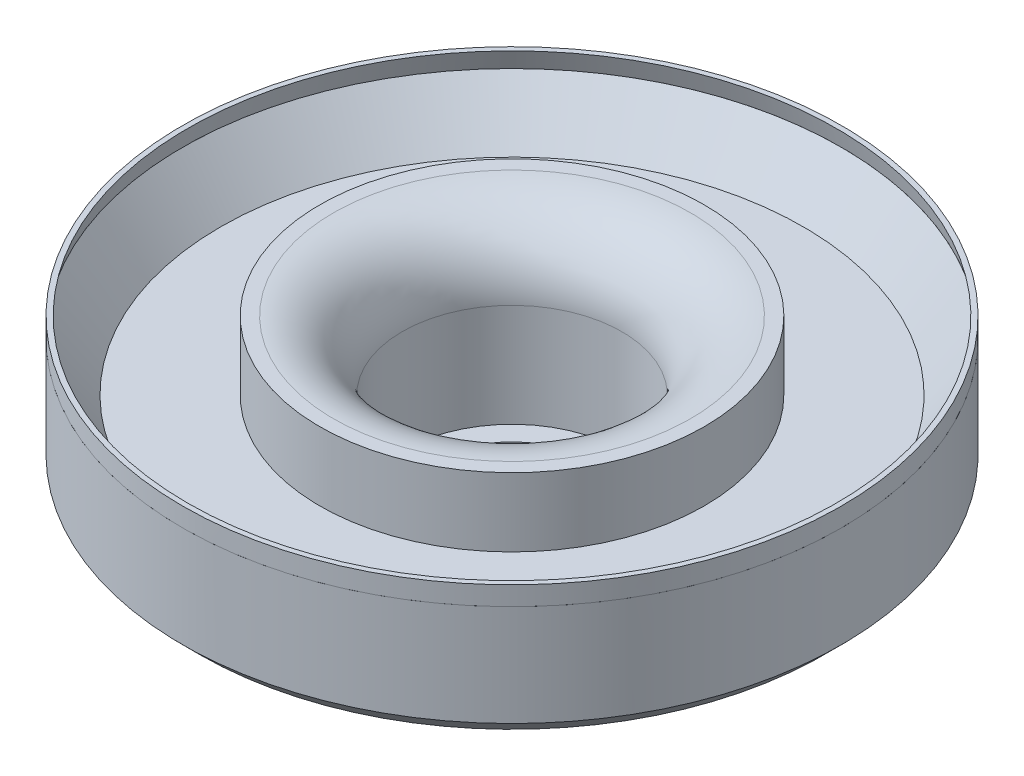
ISO-10303-21;
HEADER;
FILE_DESCRIPTION(('STEP AP214'),'2;1');
FILE_NAME('part.step','',(''),(''),'','','');
FILE_SCHEMA(('AUTOMOTIVE_DESIGN { 1 0 10303 214 1 1 1 1 }'));
ENDSEC;
DATA;
#1=APPLICATION_CONTEXT('core data for automotive mechanical design processes');
#2=APPLICATION_PROTOCOL_DEFINITION('international standard','automotive_design',2000,#1);
#3=PRODUCT_CONTEXT('',#1,'mechanical');
#4=PRODUCT('Part','Part','',(#3));
#5=PRODUCT_RELATED_PRODUCT_CATEGORY('part','',(#4));
#6=PRODUCT_DEFINITION_FORMATION('','',#4);
#7=PRODUCT_DEFINITION_CONTEXT('part definition',#1,'design');
#8=PRODUCT_DEFINITION('design','',#6,#7);
#9=PRODUCT_DEFINITION_SHAPE('','',#8);
#10=(LENGTH_UNIT() NAMED_UNIT(*) SI_UNIT(.MILLI.,.METRE.));
#11=(NAMED_UNIT(*) PLANE_ANGLE_UNIT() SI_UNIT($,.RADIAN.));
#12=(NAMED_UNIT(*) SI_UNIT($,.STERADIAN.) SOLID_ANGLE_UNIT());
#13=UNCERTAINTY_MEASURE_WITH_UNIT(LENGTH_MEASURE(1.E-05),#10,'distance_accuracy_value','');
#14=(GEOMETRIC_REPRESENTATION_CONTEXT(3) GLOBAL_UNCERTAINTY_ASSIGNED_CONTEXT((#13)) GLOBAL_UNIT_ASSIGNED_CONTEXT((#10,
#11,#12)) REPRESENTATION_CONTEXT('',''));
#15=CARTESIAN_POINT('',(0.,0.,0.));
#16=DIRECTION('',(0.,0.,1.));
#17=DIRECTION('',(1.,0.,0.));
#18=AXIS2_PLACEMENT_3D('',#15,#16,#17);
#19=CARTESIAN_POINT('',(0.,13.,0.));
#20=DIRECTION('',(0.,-1.,0.));
#21=DIRECTION('',(0.,0.,-1.));
#22=AXIS2_PLACEMENT_3D('',#19,#20,#21);
#23=CYLINDRICAL_SURFACE('',#22,4.8);
#24=CARTESIAN_POINT('',(0.,11.25,0.));
#25=DIRECTION('',(0.,-1.,0.));
#26=DIRECTION('',(0.,0.,-1.));
#27=AXIS2_PLACEMENT_3D('',#24,#25,#26);
#28=CIRCLE('',#27,4.8);
#29=CARTESIAN_POINT('',(0.,11.25,-4.8));
#30=VERTEX_POINT('',#29);
#31=EDGE_CURVE('E11',#30,#30,#28,.F.);
#32=ORIENTED_EDGE('',*,*,#31,.T.);
#33=EDGE_LOOP('',(#32));
#34=FACE_BOUND('',#33,.T.);
#35=CARTESIAN_POINT('',(0.,12.7244443697168,0.));
#36=DIRECTION('',(0.,-1.,0.));
#37=DIRECTION('',(-0.837169104331222,0.,-0.546944138603989));
#38=AXIS2_PLACEMENT_3D('',#35,#36,#37);
#39=CIRCLE('',#38,4.8);
#40=CARTESIAN_POINT('',(-4.01841170078987,12.7244443697168,-2.62533186529915));
#41=VERTEX_POINT('',#40);
#42=EDGE_CURVE('E78',#41,#41,#39,.T.);
#43=ORIENTED_EDGE('',*,*,#42,.T.);
#44=EDGE_LOOP('',(#43));
#45=FACE_BOUND('',#44,.T.);
#46=ADVANCED_FACE('F57',(#34,#45),#23,.T.);
#47=CARTESIAN_POINT('',(0.,12.7244443697168,0.));
#48=DIRECTION('',(0.,1.,0.));
#49=DIRECTION('',(0.837169104331222,0.,0.546944138603989));
#50=AXIS2_PLACEMENT_3D('',#47,#48,#49);
#51=CONICAL_SURFACE('',#50,4.8,0.654498469497876);
#52=CARTESIAN_POINT('',(0.,12.,0.));
#53=DIRECTION('',(0.,-1.,0.));
#54=DIRECTION('',(-0.837169104331222,0.,-0.546944138603989));
#55=AXIS2_PLACEMENT_3D('',#52,#53,#54);
#56=CIRCLE('',#55,4.24411428382689);
#57=CARTESIAN_POINT('',(-3.5530413536707,12.,-2.32129343110458));
#58=VERTEX_POINT('',#57);
#59=EDGE_CURVE('E87',#58,#58,#56,.T.);
#60=ORIENTED_EDGE('',*,*,#59,.T.);
#61=EDGE_LOOP('',(#60));
#62=FACE_BOUND('',#61,.T.);
#63=ORIENTED_EDGE('',*,*,#42,.F.);
#64=EDGE_LOOP('',(#63));
#65=FACE_BOUND('',#64,.T.);
#66=ADVANCED_FACE('F135',(#62,#65),#51,.F.);
#67=CARTESIAN_POINT('',(2.34407349212742,12.,1.53144358809117));
#68=DIRECTION('',(0.,1.,0.));
#69=DIRECTION('',(0.837169104331222,0.,0.546944138603989));
#70=AXIS2_PLACEMENT_3D('',#67,#68,#69);
#71=PLANE('',#70);
#72=CARTESIAN_POINT('',(0.,12.,0.));
#73=DIRECTION('',(0.,-1.,0.));
#74=DIRECTION('',(-0.837169104331222,0.,-0.546944138603989));
#75=AXIS2_PLACEMENT_3D('',#72,#73,#74);
#76=CIRCLE('',#75,2.8);
#77=CARTESIAN_POINT('',(-2.34407349212742,12.,-1.53144358809117));
#78=VERTEX_POINT('',#77);
#79=EDGE_CURVE('E90',#78,#78,#76,.T.);
#80=ORIENTED_EDGE('',*,*,#79,.T.);
#81=EDGE_LOOP('',(#80));
#82=FACE_BOUND('',#81,.T.);
#83=ORIENTED_EDGE('',*,*,#59,.F.);
#84=EDGE_LOOP('',(#83));
#85=FACE_BOUND('',#84,.T.);
#86=ADVANCED_FACE('F140',(#82,#85),#71,.T.);
#87=CARTESIAN_POINT('',(0.,7.7014445131331,0.));
#88=DIRECTION('',(0.,-1.,0.));
#89=DIRECTION('',(-0.837169104331222,0.,-0.546944138603989));
#90=AXIS2_PLACEMENT_3D('',#87,#88,#89);
#91=CYLINDRICAL_SURFACE('',#90,2.8);
#92=CARTESIAN_POINT('',(0.,13.,0.));
#93=DIRECTION('',(0.,-1.,0.));
#94=DIRECTION('',(-0.837169104331222,0.,-0.546944138603989));
#95=AXIS2_PLACEMENT_3D('',#92,#93,#94);
#96=CIRCLE('',#95,2.8);
#97=CARTESIAN_POINT('',(-2.34407349212742,13.,-1.53144358809117));
#98=VERTEX_POINT('',#97);
#99=EDGE_CURVE('E93',#98,#98,#96,.T.);
#100=ORIENTED_EDGE('',*,*,#99,.T.);
#101=EDGE_LOOP('',(#100));
#102=FACE_BOUND('',#101,.T.);
#103=ORIENTED_EDGE('',*,*,#79,.F.);
#104=EDGE_LOOP('',(#103));
#105=FACE_BOUND('',#104,.T.);
#106=ADVANCED_FACE('F182',(#102,#105),#91,.T.);
#107=CARTESIAN_POINT('',(0.,13.,0.));
#108=DIRECTION('',(0.,1.,0.));
#109=DIRECTION('',(0.,0.,1.));
#110=AXIS2_PLACEMENT_3D('',#107,#108,#109);
#111=PLANE('',#110);
#112=CARTESIAN_POINT('',(0.,13.,0.));
#113=DIRECTION('',(0.,1.,0.));
#114=DIRECTION('',(0.837169104331222,0.,0.546944138603989));
#115=AXIS2_PLACEMENT_3D('',#112,#113,#114);
#116=CIRCLE('',#115,2.6);
#117=CARTESIAN_POINT('',(2.17663967126118,13.,1.42205476037037));
#118=VERTEX_POINT('',#117);
#119=EDGE_CURVE('E79',#118,#118,#116,.T.);
#120=ORIENTED_EDGE('',*,*,#119,.F.);
#121=EDGE_LOOP('',(#120));
#122=FACE_BOUND('',#121,.T.);
#123=ORIENTED_EDGE('',*,*,#99,.F.);
#124=EDGE_LOOP('',(#123));
#125=FACE_BOUND('',#124,.T.);
#126=ADVANCED_FACE('F174',(#122,#125),#111,.T.);
#127=CARTESIAN_POINT('',(0.,7.7014445131331,0.));
#128=DIRECTION('',(0.,-1.,0.));
#129=DIRECTION('',(-0.837169104331222,0.,-0.546944138603989));
#130=AXIS2_PLACEMENT_3D('',#127,#128,#129);
#131=CYLINDRICAL_SURFACE('',#130,1.6);
#132=CARTESIAN_POINT('',(0.,12.,0.));
#133=DIRECTION('',(0.,1.,0.));
#134=DIRECTION('',(0.837169104331222,0.,0.546944138603989));
#135=AXIS2_PLACEMENT_3D('',#132,#133,#134);
#136=CIRCLE('',#135,1.6);
#137=CARTESIAN_POINT('',(1.33947056692996,12.,0.875110621766382));
#138=VERTEX_POINT('',#137);
#139=EDGE_CURVE('E83',#138,#138,#136,.F.);
#140=ORIENTED_EDGE('',*,*,#139,.F.);
#141=EDGE_LOOP('',(#140));
#142=FACE_BOUND('',#141,.T.);
#143=CARTESIAN_POINT('',(0.,10.5,0.));
#144=DIRECTION('',(0.,-1.,0.));
#145=DIRECTION('',(-0.837169104331222,0.,-0.546944138603989));
#146=AXIS2_PLACEMENT_3D('',#143,#144,#145);
#147=CIRCLE('',#146,1.6);
#148=CARTESIAN_POINT('',(-1.33947056692996,10.5,-0.875110621766382));
#149=VERTEX_POINT('',#148);
#150=EDGE_CURVE('E82',#149,#149,#147,.T.);
#151=ORIENTED_EDGE('',*,*,#150,.T.);
#152=EDGE_LOOP('',(#151));
#153=FACE_BOUND('',#152,.T.);
#154=ADVANCED_FACE('F172',(#142,#153),#131,.F.);
#155=CARTESIAN_POINT('',(0.,12.,0.));
#156=DIRECTION('',(0.,1.,0.));
#157=DIRECTION('',(0.837169104331222,0.,0.546944138603989));
#158=AXIS2_PLACEMENT_3D('',#155,#156,#157);
#159=TOROIDAL_SURFACE('',#158,2.6,1.);
#160=ORIENTED_EDGE('',*,*,#119,.T.);
#161=EDGE_LOOP('',(#160));
#162=FACE_BOUND('',#161,.T.);
#163=ORIENTED_EDGE('',*,*,#139,.T.);
#164=EDGE_LOOP('',(#163));
#165=FACE_BOUND('',#164,.T.);
#166=ADVANCED_FACE('F168',(#162,#165),#159,.T.);
#167=CARTESIAN_POINT('',(1.33947056692996,10.5,0.875110621766382));
#168=DIRECTION('',(0.,1.,0.));
#169=DIRECTION('',(0.837169104331222,0.,0.546944138603989));
#170=AXIS2_PLACEMENT_3D('',#167,#168,#169);
#171=PLANE('',#170);
#172=CARTESIAN_POINT('',(0.,10.5,0.));
#173=DIRECTION('',(0.,-1.,0.));
#174=DIRECTION('',(0.546944138603989,0.,-0.837169104331222));
#175=AXIS2_PLACEMENT_3D('',#172,#173,#174);
#176=CIRCLE('',#175,1.275);
#177=CARTESIAN_POINT('',(0.697353776720086,10.5,-1.06739060802231));
#178=VERTEX_POINT('',#177);
#179=EDGE_CURVE('E86',#178,#178,#176,.T.);
#180=ORIENTED_EDGE('',*,*,#179,.T.);
#181=EDGE_LOOP('',(#180));
#182=FACE_BOUND('',#181,.T.);
#183=ORIENTED_EDGE('',*,*,#150,.F.);
#184=EDGE_LOOP('',(#183));
#185=FACE_BOUND('',#184,.T.);
#186=ADVANCED_FACE('F162',(#182,#185),#171,.T.);
#187=CARTESIAN_POINT('',(0.,10.5,0.));
#188=DIRECTION('',(0.,-1.,0.));
#189=DIRECTION('',(0.546944138603989,0.,-0.837169104331222));
#190=AXIS2_PLACEMENT_3D('',#187,#188,#189);
#191=CONICAL_SURFACE('',#190,1.275,0.785398163397479);
#192=CARTESIAN_POINT('',(0.,10.525,0.));
#193=DIRECTION('',(0.,-1.,0.));
#194=DIRECTION('',(0.,0.,-1.));
#195=AXIS2_PLACEMENT_3D('',#192,#193,#194);
#196=CIRCLE('',#195,1.25);
#197=CARTESIAN_POINT('',(0.,10.525,-1.25));
#198=VERTEX_POINT('',#197);
#199=EDGE_CURVE('E105',#198,#198,#196,.F.);
#200=ORIENTED_EDGE('',*,*,#199,.F.);
#201=EDGE_LOOP('',(#200));
#202=FACE_BOUND('',#201,.T.);
#203=ORIENTED_EDGE('',*,*,#179,.F.);
#204=EDGE_LOOP('',(#203));
#205=FACE_BOUND('',#204,.T.);
#206=ADVANCED_FACE('F131',(#202,#205),#191,.T.);
#207=CARTESIAN_POINT('',(0.,11.,0.));
#208=DIRECTION('',(0.,-1.,0.));
#209=DIRECTION('',(0.,0.,-1.));
#210=AXIS2_PLACEMENT_3D('',#207,#208,#209);
#211=PLANE('',#210);
#212=CARTESIAN_POINT('',(0.,11.,0.));
#213=DIRECTION('',(0.,-1.,0.));
#214=DIRECTION('',(0.,0.,-1.));
#215=AXIS2_PLACEMENT_3D('',#212,#213,#214);
#216=CIRCLE('',#215,4.55);
#217=CARTESIAN_POINT('',(0.,11.,-4.55));
#218=VERTEX_POINT('',#217);
#219=EDGE_CURVE('E65',#218,#218,#216,.T.);
#220=ORIENTED_EDGE('',*,*,#219,.T.);
#221=EDGE_LOOP('',(#220));
#222=FACE_BOUND('',#221,.T.);
#223=CARTESIAN_POINT('',(0.,11.,0.));
#224=DIRECTION('',(0.,-1.,0.));
#225=DIRECTION('',(0.,0.,-1.));
#226=AXIS2_PLACEMENT_3D('',#223,#224,#225);
#227=CIRCLE('',#226,3.25);
#228=CARTESIAN_POINT('',(0.,11.,-3.25));
#229=VERTEX_POINT('',#228);
#230=EDGE_CURVE('E69',#229,#229,#227,.F.);
#231=ORIENTED_EDGE('',*,*,#230,.T.);
#232=EDGE_LOOP('',(#231));
#233=FACE_BOUND('',#232,.T.);
#234=ADVANCED_FACE('F123',(#222,#233),#211,.T.);
#235=CARTESIAN_POINT('',(0.,11.,0.));
#236=DIRECTION('',(0.,-1.,0.));
#237=DIRECTION('',(0.,0.,-1.));
#238=AXIS2_PLACEMENT_3D('',#235,#236,#237);
#239=CYLINDRICAL_SURFACE('',#238,3.);
#240=CARTESIAN_POINT('',(0.,10.75,0.));
#241=DIRECTION('',(0.,-1.,0.));
#242=DIRECTION('',(0.,0.,-1.));
#243=AXIS2_PLACEMENT_3D('',#240,#241,#242);
#244=CIRCLE('',#243,3.);
#245=CARTESIAN_POINT('',(0.,10.75,-3.));
#246=VERTEX_POINT('',#245);
#247=EDGE_CURVE('E73',#246,#246,#244,.T.);
#248=ORIENTED_EDGE('',*,*,#247,.T.);
#249=EDGE_LOOP('',(#248));
#250=FACE_BOUND('',#249,.T.);
#251=CARTESIAN_POINT('',(0.,10.,0.));
#252=DIRECTION('',(0.,-1.,0.));
#253=DIRECTION('',(0.,0.,-1.));
#254=AXIS2_PLACEMENT_3D('',#251,#252,#253);
#255=CIRCLE('',#254,3.);
#256=CARTESIAN_POINT('',(0.,10.,-3.));
#257=VERTEX_POINT('',#256);
#258=EDGE_CURVE('E100',#257,#257,#255,.T.);
#259=ORIENTED_EDGE('',*,*,#258,.F.);
#260=EDGE_LOOP('',(#259));
#261=FACE_BOUND('',#260,.T.);
#262=ADVANCED_FACE('F118',(#250,#261),#239,.T.);
#263=CARTESIAN_POINT('',(-6.73510400247556,10.,-4.81));
#264=DIRECTION('',(0.,-1.,0.));
#265=DIRECTION('',(0.,0.,-1.));
#266=AXIS2_PLACEMENT_3D('',#263,#264,#265);
#267=PLANE('',#266);
#268=CARTESIAN_POINT('',(0.,10.,0.));
#269=DIRECTION('',(0.,-1.,0.));
#270=DIRECTION('',(0.,0.,-1.));
#271=AXIS2_PLACEMENT_3D('',#268,#269,#270);
#272=CIRCLE('',#271,1.25);
#273=CARTESIAN_POINT('',(0.,10.,-1.25));
#274=VERTEX_POINT('',#273);
#275=EDGE_CURVE('E108',#274,#274,#272,.T.);
#276=ORIENTED_EDGE('',*,*,#275,.F.);
#277=EDGE_LOOP('',(#276));
#278=FACE_BOUND('',#277,.T.);
#279=ORIENTED_EDGE('',*,*,#258,.T.);
#280=EDGE_LOOP('',(#279));
#281=FACE_BOUND('',#280,.T.);
#282=ADVANCED_FACE('F114',(#278,#281),#267,.T.);
#283=CARTESIAN_POINT('',(0.,10.75,0.));
#284=DIRECTION('',(0.,-1.,0.));
#285=DIRECTION('',(0.,0.,-1.));
#286=AXIS2_PLACEMENT_3D('',#283,#284,#285);
#287=TOROIDAL_SURFACE('',#286,3.25,0.25);
#288=ORIENTED_EDGE('',*,*,#230,.F.);
#289=EDGE_LOOP('',(#288));
#290=FACE_BOUND('',#289,.T.);
#291=ORIENTED_EDGE('',*,*,#247,.F.);
#292=EDGE_LOOP('',(#291));
#293=FACE_BOUND('',#292,.T.);
#294=ADVANCED_FACE('F117',(#290,#293),#287,.F.);
#295=CARTESIAN_POINT('',(0.,14.,0.));
#296=DIRECTION('',(0.,-1.,0.));
#297=DIRECTION('',(0.,0.,-1.));
#298=AXIS2_PLACEMENT_3D('',#295,#296,#297);
#299=CYLINDRICAL_SURFACE('',#298,1.25);
#300=ORIENTED_EDGE('',*,*,#199,.T.);
#301=EDGE_LOOP('',(#300));
#302=FACE_BOUND('',#301,.T.);
#303=ORIENTED_EDGE('',*,*,#275,.T.);
#304=EDGE_LOOP('',(#303));
#305=FACE_BOUND('',#304,.T.);
#306=ADVANCED_FACE('F112',(#302,#305),#299,.F.);
#307=CARTESIAN_POINT('',(0.,11.,0.));
#308=DIRECTION('',(0.,1.,0.));
#309=DIRECTION('',(0.,0.,1.));
#310=AXIS2_PLACEMENT_3D('',#307,#308,#309);
#311=CONICAL_SURFACE('',#310,4.55,0.785398163397447);
#312=ORIENTED_EDGE('',*,*,#31,.F.);
#313=EDGE_LOOP('',(#312));
#314=FACE_BOUND('',#313,.T.);
#315=ORIENTED_EDGE('',*,*,#219,.F.);
#316=EDGE_LOOP('',(#315));
#317=FACE_BOUND('',#316,.T.);
#318=ADVANCED_FACE('F60',(#314,#317),#311,.T.);
#319=CLOSED_SHELL('',(#46,#66,#86,#106,#126,#154,#166,#186,#206,#234,#262,#282,#294,#306,#318));
#320=MANIFOLD_SOLID_BREP('B2',#319);
#321=CARTESIAN_POINT('',(0.,13.,0.));
#322=DIRECTION('',(0.,1.,0.));
#323=DIRECTION('',(0.,0.,1.));
#324=AXIS2_PLACEMENT_3D('',#321,#322,#323);
#325=PLANE('',#324);
#326=CARTESIAN_POINT('',(0.,13.,0.));
#327=DIRECTION('',(0.,1.,0.));
#328=DIRECTION('',(0.,0.,1.));
#329=AXIS2_PLACEMENT_3D('',#326,#327,#328);
#330=CIRCLE('',#329,4.8);
#331=CARTESIAN_POINT('',(0.,13.,4.8));
#332=VERTEX_POINT('',#331);
#333=EDGE_CURVE('E56',#332,#332,#330,.T.);
#334=ORIENTED_EDGE('',*,*,#333,.T.);
#335=EDGE_LOOP('',(#334));
#336=FACE_BOUND('',#335,.T.);
#337=CARTESIAN_POINT('',(0.,13.,0.));
#338=DIRECTION('',(0.,1.,0.));
#339=DIRECTION('',(0.,0.,1.));
#340=AXIS2_PLACEMENT_3D('',#337,#338,#339);
#341=CIRCLE('',#340,4.72616509139577);
#342=CARTESIAN_POINT('',(0.,13.,4.72616509139577));
#343=VERTEX_POINT('',#342);
#344=EDGE_CURVE('E298',#343,#343,#341,.F.);
#345=ORIENTED_EDGE('',*,*,#344,.T.);
#346=EDGE_LOOP('',(#345));
#347=FACE_BOUND('',#346,.T.);
#348=ADVANCED_FACE('F294',(#336,#347),#325,.T.);
#349=CARTESIAN_POINT('',(0.,13.,0.));
#350=DIRECTION('',(0.,-1.,0.));
#351=DIRECTION('',(0.,0.,-1.));
#352=AXIS2_PLACEMENT_3D('',#349,#350,#351);
#353=CYLINDRICAL_SURFACE('',#352,4.8);
#354=CARTESIAN_POINT('',(0.,12.7244443697168,0.));
#355=DIRECTION('',(0.,-1.,0.));
#356=DIRECTION('',(-0.837169104331222,0.,-0.546944138603989));
#357=AXIS2_PLACEMENT_3D('',#354,#355,#356);
#358=CIRCLE('',#357,4.8);
#359=CARTESIAN_POINT('',(-4.01841170078987,12.7244443697168,-2.62533186529915));
#360=VERTEX_POINT('',#359);
#361=EDGE_CURVE('E305',#360,#360,#358,.T.);
#362=ORIENTED_EDGE('',*,*,#361,.F.);
#363=EDGE_LOOP('',(#362));
#364=FACE_BOUND('',#363,.T.);
#365=ORIENTED_EDGE('',*,*,#333,.F.);
#366=EDGE_LOOP('',(#365));
#367=FACE_BOUND('',#366,.T.);
#368=ADVANCED_FACE('F296',(#364,#367),#353,.T.);
#369=CARTESIAN_POINT('',(0.,15.4441142838269,0.));
#370=DIRECTION('',(0.,-1.,0.));
#371=DIRECTION('',(-0.837169104331222,0.,-0.546944138603989));
#372=AXIS2_PLACEMENT_3D('',#369,#370,#371);
#373=CONICAL_SURFACE('',#372,4.07126664283499,0.261799387799145);
#374=ORIENTED_EDGE('',*,*,#344,.F.);
#375=EDGE_LOOP('',(#374));
#376=FACE_BOUND('',#375,.T.);
#377=ORIENTED_EDGE('',*,*,#361,.T.);
#378=EDGE_LOOP('',(#377));
#379=FACE_BOUND('',#378,.T.);
#380=ADVANCED_FACE('F310',(#376,#379),#373,.F.);
#381=CLOSED_SHELL('',(#348,#368,#380));
#382=MANIFOLD_SOLID_BREP('B6',#381);
#383=ADVANCED_BREP_SHAPE_REPRESENTATION('',(#18,#320,#382),#14);
#384=SHAPE_DEFINITION_REPRESENTATION(#9,#383);
ENDSEC;
END-ISO-10303-21;
